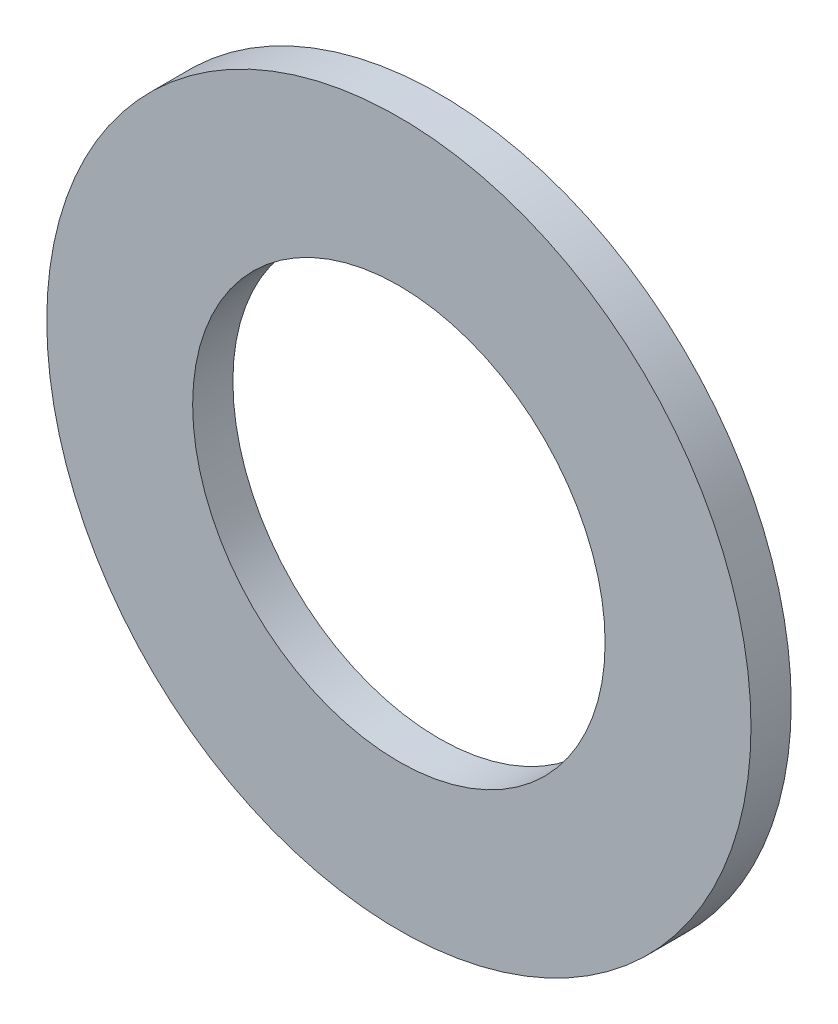
ISO-10303-21;
HEADER;
FILE_DESCRIPTION(('STEP AP214'),'2;1');
FILE_NAME('part.step','',(''),(''),'','','');
FILE_SCHEMA(('AUTOMOTIVE_DESIGN { 1 0 10303 214 1 1 1 1 }'));
ENDSEC;
DATA;
#1=APPLICATION_CONTEXT('core data for automotive mechanical design processes');
#2=APPLICATION_PROTOCOL_DEFINITION('international standard','automotive_design',2000,#1);
#3=PRODUCT_CONTEXT('',#1,'mechanical');
#4=PRODUCT('Part','Part','',(#3));
#5=PRODUCT_RELATED_PRODUCT_CATEGORY('part','',(#4));
#6=PRODUCT_DEFINITION_FORMATION('','',#4);
#7=PRODUCT_DEFINITION_CONTEXT('part definition',#1,'design');
#8=PRODUCT_DEFINITION('design','',#6,#7);
#9=PRODUCT_DEFINITION_SHAPE('','',#8);
#10=(LENGTH_UNIT() NAMED_UNIT(*) SI_UNIT(.MILLI.,.METRE.));
#11=(NAMED_UNIT(*) PLANE_ANGLE_UNIT() SI_UNIT($,.RADIAN.));
#12=(NAMED_UNIT(*) SI_UNIT($,.STERADIAN.) SOLID_ANGLE_UNIT());
#13=UNCERTAINTY_MEASURE_WITH_UNIT(LENGTH_MEASURE(1.E-05),#10,'distance_accuracy_value','');
#14=(GEOMETRIC_REPRESENTATION_CONTEXT(3) GLOBAL_UNCERTAINTY_ASSIGNED_CONTEXT((#13)) GLOBAL_UNIT_ASSIGNED_CONTEXT((#10,
#11,#12)) REPRESENTATION_CONTEXT('',''));
#15=CARTESIAN_POINT('',(0.,0.,0.));
#16=DIRECTION('',(0.,0.,1.));
#17=DIRECTION('',(1.,0.,0.));
#18=AXIS2_PLACEMENT_3D('',#15,#16,#17);
#19=CARTESIAN_POINT('',(0.,0.,0.8));
#20=DIRECTION('',(0.,0.,1.));
#21=DIRECTION('',(1.,0.,0.));
#22=AXIS2_PLACEMENT_3D('',#19,#20,#21);
#23=PLANE('',#22);
#24=CARTESIAN_POINT('',(0.,0.,0.8));
#25=DIRECTION('',(0.,0.,1.));
#26=DIRECTION('',(1.,0.,0.));
#27=AXIS2_PLACEMENT_3D('',#24,#25,#26);
#28=CIRCLE('',#27,7.);
#29=CARTESIAN_POINT('',(7.,0.,0.8));
#30=VERTEX_POINT('',#29);
#31=EDGE_CURVE('E10',#30,#30,#28,.T.);
#32=ORIENTED_EDGE('',*,*,#31,.T.);
#33=EDGE_LOOP('',(#32));
#34=FACE_BOUND('',#33,.T.);
#35=CARTESIAN_POINT('',(0.,0.,0.8));
#36=DIRECTION('',(0.,0.,1.));
#37=DIRECTION('',(1.,0.,0.));
#38=AXIS2_PLACEMENT_3D('',#35,#36,#37);
#39=CIRCLE('',#38,4.1);
#40=CARTESIAN_POINT('',(4.1,0.,0.8));
#41=VERTEX_POINT('',#40);
#42=EDGE_CURVE('E44',#41,#41,#39,.T.);
#43=ORIENTED_EDGE('',*,*,#42,.F.);
#44=EDGE_LOOP('',(#43));
#45=FACE_BOUND('',#44,.T.);
#46=ADVANCED_FACE('F33',(#34,#45),#23,.T.);
#47=CARTESIAN_POINT('',(0.,0.,0.));
#48=DIRECTION('',(0.,0.,1.));
#49=DIRECTION('',(1.,0.,0.));
#50=AXIS2_PLACEMENT_3D('',#47,#48,#49);
#51=PLANE('',#50);
#52=CARTESIAN_POINT('',(0.,0.,0.));
#53=DIRECTION('',(0.,0.,1.));
#54=DIRECTION('',(1.,0.,0.));
#55=AXIS2_PLACEMENT_3D('',#52,#53,#54);
#56=CIRCLE('',#55,7.);
#57=CARTESIAN_POINT('',(7.,0.,0.));
#58=VERTEX_POINT('',#57);
#59=EDGE_CURVE('E37',#58,#58,#56,.T.);
#60=ORIENTED_EDGE('',*,*,#59,.F.);
#61=EDGE_LOOP('',(#60));
#62=FACE_BOUND('',#61,.T.);
#63=CARTESIAN_POINT('',(0.,0.,0.));
#64=DIRECTION('',(0.,0.,1.));
#65=DIRECTION('',(1.,0.,0.));
#66=AXIS2_PLACEMENT_3D('',#63,#64,#65);
#67=CIRCLE('',#66,4.1);
#68=CARTESIAN_POINT('',(4.1,0.,0.));
#69=VERTEX_POINT('',#68);
#70=EDGE_CURVE('E46',#69,#69,#67,.T.);
#71=ORIENTED_EDGE('',*,*,#70,.T.);
#72=EDGE_LOOP('',(#71));
#73=FACE_BOUND('',#72,.T.);
#74=ADVANCED_FACE('F56',(#62,#73),#51,.F.);
#75=CARTESIAN_POINT('',(0.,0.,0.8));
#76=DIRECTION('',(0.,0.,-1.));
#77=DIRECTION('',(-1.,0.,0.));
#78=AXIS2_PLACEMENT_3D('',#75,#76,#77);
#79=CYLINDRICAL_SURFACE('',#78,7.);
#80=ORIENTED_EDGE('',*,*,#31,.F.);
#81=EDGE_LOOP('',(#80));
#82=FACE_BOUND('',#81,.T.);
#83=ORIENTED_EDGE('',*,*,#59,.T.);
#84=EDGE_LOOP('',(#83));
#85=FACE_BOUND('',#84,.T.);
#86=ADVANCED_FACE('F35',(#82,#85),#79,.T.);
#87=CARTESIAN_POINT('',(0.,0.,0.8));
#88=DIRECTION('',(0.,0.,-1.));
#89=DIRECTION('',(-1.,0.,0.));
#90=AXIS2_PLACEMENT_3D('',#87,#88,#89);
#91=CYLINDRICAL_SURFACE('',#90,4.1);
#92=ORIENTED_EDGE('',*,*,#42,.T.);
#93=EDGE_LOOP('',(#92));
#94=FACE_BOUND('',#93,.T.);
#95=ORIENTED_EDGE('',*,*,#70,.F.);
#96=EDGE_LOOP('',(#95));
#97=FACE_BOUND('',#96,.T.);
#98=ADVANCED_FACE('F52',(#94,#97),#91,.F.);
#99=CLOSED_SHELL('',(#46,#74,#86,#98));
#100=MANIFOLD_SOLID_BREP('B2',#99);
#101=ADVANCED_BREP_SHAPE_REPRESENTATION('',(#18,#100),#14);
#102=SHAPE_DEFINITION_REPRESENTATION(#9,#101);
ENDSEC;
END-ISO-10303-21;
